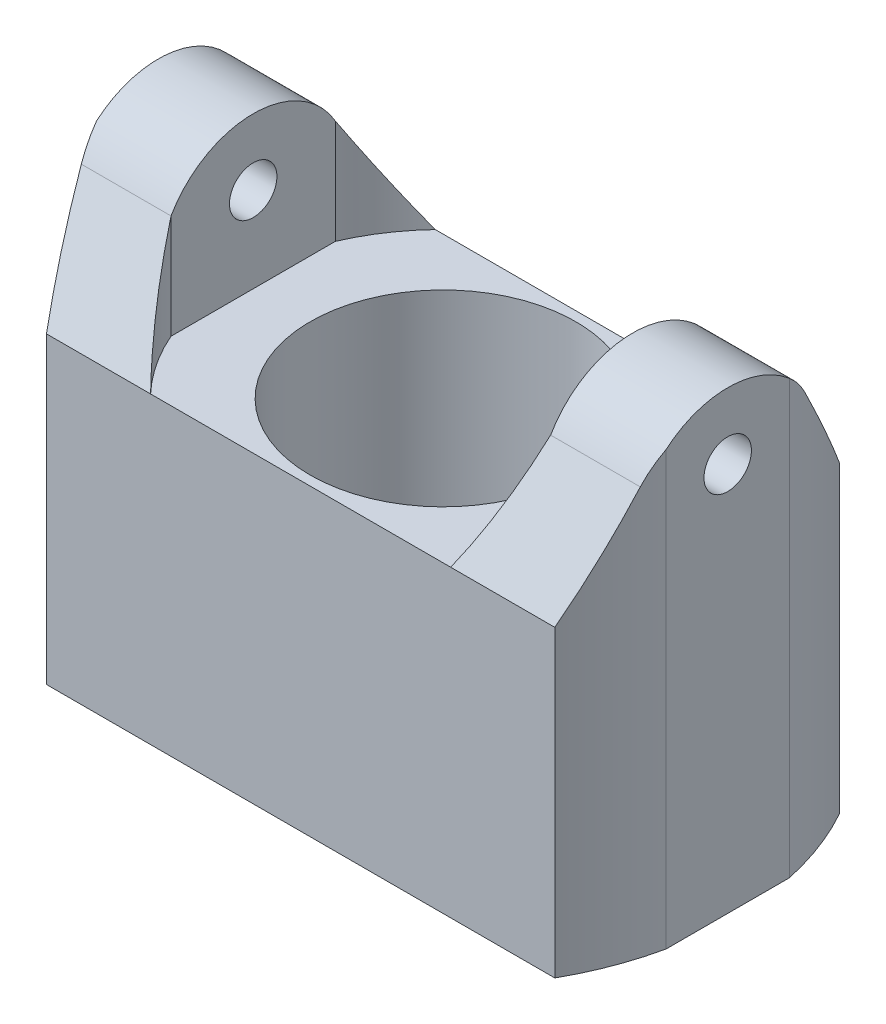
ISO-10303-21;
HEADER;
FILE_DESCRIPTION(('STEP AP214'),'2;1');
FILE_NAME('part.step','',(''),(''),'','','');
FILE_SCHEMA(('AUTOMOTIVE_DESIGN { 1 0 10303 214 1 1 1 1 }'));
ENDSEC;
DATA;
#1=APPLICATION_CONTEXT('core data for automotive mechanical design processes');
#2=APPLICATION_PROTOCOL_DEFINITION('international standard','automotive_design',2000,#1);
#3=PRODUCT_CONTEXT('',#1,'mechanical');
#4=PRODUCT('Part','Part','',(#3));
#5=PRODUCT_RELATED_PRODUCT_CATEGORY('part','',(#4));
#6=PRODUCT_DEFINITION_FORMATION('','',#4);
#7=PRODUCT_DEFINITION_CONTEXT('part definition',#1,'design');
#8=PRODUCT_DEFINITION('design','',#6,#7);
#9=PRODUCT_DEFINITION_SHAPE('','',#8);
#10=(LENGTH_UNIT() NAMED_UNIT(*) SI_UNIT(.MILLI.,.METRE.));
#11=(NAMED_UNIT(*) PLANE_ANGLE_UNIT() SI_UNIT($,.RADIAN.));
#12=(NAMED_UNIT(*) SI_UNIT($,.STERADIAN.) SOLID_ANGLE_UNIT());
#13=UNCERTAINTY_MEASURE_WITH_UNIT(LENGTH_MEASURE(1.E-05),#10,'distance_accuracy_value','');
#14=(GEOMETRIC_REPRESENTATION_CONTEXT(3) GLOBAL_UNCERTAINTY_ASSIGNED_CONTEXT((#13)) GLOBAL_UNIT_ASSIGNED_CONTEXT((#10,
#11,#12)) REPRESENTATION_CONTEXT('',''));
#15=CARTESIAN_POINT('',(0.,0.,0.));
#16=DIRECTION('',(0.,0.,1.));
#17=DIRECTION('',(1.,0.,0.));
#18=AXIS2_PLACEMENT_3D('',#15,#16,#17);
#19=CARTESIAN_POINT('',(0.,32.,0.));
#20=DIRECTION('',(0.,-1.,0.));
#21=DIRECTION('',(0.,0.,-1.));
#22=AXIS2_PLACEMENT_3D('',#19,#20,#21);
#23=CYLINDRICAL_SURFACE('',#22,14.);
#24=CARTESIAN_POINT('',(0.,0.,0.));
#25=DIRECTION('',(0.,1.,0.));
#26=DIRECTION('',(0.,0.,1.));
#27=AXIS2_PLACEMENT_3D('',#24,#25,#26);
#28=CIRCLE('',#27,14.);
#29=CARTESIAN_POINT('',(0.,0.,14.));
#30=VERTEX_POINT('',#29);
#31=EDGE_CURVE('E212',#30,#30,#28,.T.);
#32=ORIENTED_EDGE('',*,*,#31,.F.);
#33=EDGE_LOOP('',(#32));
#34=FACE_BOUND('',#33,.T.);
#35=CARTESIAN_POINT('',(0.,32.,0.));
#36=DIRECTION('',(0.,1.,0.));
#37=DIRECTION('',(0.,0.,1.));
#38=AXIS2_PLACEMENT_3D('',#35,#36,#37);
#39=CIRCLE('',#38,14.);
#40=CARTESIAN_POINT('',(0.,32.,14.));
#41=VERTEX_POINT('',#40);
#42=EDGE_CURVE('E345',#41,#41,#39,.T.);
#43=ORIENTED_EDGE('',*,*,#42,.T.);
#44=EDGE_LOOP('',(#43));
#45=FACE_BOUND('',#44,.T.);
#46=ADVANCED_FACE('F45',(#34,#45),#23,.F.);
#47=CARTESIAN_POINT('',(-30.,32.,-15.));
#48=DIRECTION('',(0.,0.5,-0.866025403784439));
#49=DIRECTION('',(0.,0.866025403784439,0.5));
#50=AXIS2_PLACEMENT_3D('',#47,#48,#49);
#51=PLANE('',#50);
#52=CARTESIAN_POINT('',(0.,57.9807621135332,0.));
#53=DIRECTION('',(0.,0.5,-0.866025403784439));
#54=DIRECTION('',(0.,0.866025403784439,0.5));
#55=AXIS2_PLACEMENT_3D('',#52,#53,#54);
#56=ELLIPSE('',#55,43.5889894354067,21.7944947177034);
#57=CARTESIAN_POINT('',(-15.8113883008419,32.,-15.));
#58=VERTEX_POINT('',#57);
#59=CARTESIAN_POINT('',(-20.,42.9807621135332,-8.66025403784438));
#60=VERTEX_POINT('',#59);
#61=EDGE_CURVE('E12',#58,#60,#56,.T.);
#62=ORIENTED_EDGE('',*,*,#61,.F.);
#63=DIRECTION('',(1.,0.,0.));
#64=VECTOR('',#63,1.);
#65=CARTESIAN_POINT('',(0.,32.,-15.));
#66=LINE('',#65,#64);
#67=CARTESIAN_POINT('',(-26.7815234816842,32.,-15.));
#68=VERTEX_POINT('',#67);
#69=EDGE_CURVE('E208',#68,#58,#66,.T.);
#70=ORIENTED_EDGE('',*,*,#69,.F.);
#71=CARTESIAN_POINT('',(0.,57.9807621135332,0.));
#72=DIRECTION('',(0.,0.5,-0.866025403784439));
#73=DIRECTION('',(0.,-0.866025403784439,-0.5));
#74=AXIS2_PLACEMENT_3D('',#71,#72,#73);
#75=ELLIPSE('',#74,61.3921819126833,30.6960909563417);
#76=CARTESIAN_POINT('',(-29.4491086452544,42.9807621135332,-8.66025403784439));
#77=VERTEX_POINT('',#76);
#78=EDGE_CURVE('E206',#68,#77,#75,.T.);
#79=ORIENTED_EDGE('',*,*,#78,.T.);
#80=DIRECTION('',(1.,0.,0.));
#81=VECTOR('',#80,1.);
#82=CARTESIAN_POINT('',(-30.,42.9807621135332,-8.66025403784439));
#83=LINE('',#82,#81);
#84=EDGE_CURVE('E246',#77,#60,#83,.T.);
#85=ORIENTED_EDGE('',*,*,#84,.T.);
#86=EDGE_LOOP('',(#62,#70,#79,#85));
#87=FACE_BOUND('',#86,.T.);
#88=ADVANCED_FACE('F383',(#87),#51,.T.);
#89=CARTESIAN_POINT('',(-30.,57.9807621135332,0.));
#90=DIRECTION('',(0.,0.5,0.866025403784439));
#91=DIRECTION('',(0.,-0.866025403784439,0.5));
#92=AXIS2_PLACEMENT_3D('',#89,#90,#91);
#93=PLANE('',#92);
#94=CARTESIAN_POINT('',(0.,57.9807621135332,0.));
#95=DIRECTION('',(0.,0.5,0.866025403784439));
#96=DIRECTION('',(0.,0.866025403784439,-0.5));
#97=AXIS2_PLACEMENT_3D('',#94,#95,#96);
#98=ELLIPSE('',#97,43.5889894354067,21.7944947177034);
#99=CARTESIAN_POINT('',(-20.,42.9807621135332,8.66025403784438));
#100=VERTEX_POINT('',#99);
#101=CARTESIAN_POINT('',(-15.8113883008419,32.,15.));
#102=VERTEX_POINT('',#101);
#103=EDGE_CURVE('E189',#100,#102,#98,.T.);
#104=ORIENTED_EDGE('',*,*,#103,.F.);
#105=DIRECTION('',(1.,0.,0.));
#106=VECTOR('',#105,1.);
#107=CARTESIAN_POINT('',(-30.,42.9807621135332,8.66025403784438));
#108=LINE('',#107,#106);
#109=CARTESIAN_POINT('',(-29.4491086452545,42.9807621135332,8.66025403784437));
#110=VERTEX_POINT('',#109);
#111=EDGE_CURVE('E250',#100,#110,#108,.F.);
#112=ORIENTED_EDGE('',*,*,#111,.T.);
#113=CARTESIAN_POINT('',(0.,57.9807621135332,0.));
#114=DIRECTION('',(0.,0.5,0.866025403784439));
#115=DIRECTION('',(0.,-0.866025403784439,0.5));
#116=AXIS2_PLACEMENT_3D('',#113,#114,#115);
#117=ELLIPSE('',#116,61.3921819126833,30.6960909563417);
#118=CARTESIAN_POINT('',(-26.7815234816842,32.,15.));
#119=VERTEX_POINT('',#118);
#120=EDGE_CURVE('E242',#110,#119,#117,.T.);
#121=ORIENTED_EDGE('',*,*,#120,.T.);
#122=DIRECTION('',(1.,0.,0.));
#123=VECTOR('',#122,1.);
#124=CARTESIAN_POINT('',(0.,32.,15.));
#125=LINE('',#124,#123);
#126=EDGE_CURVE('E196',#119,#102,#125,.T.);
#127=ORIENTED_EDGE('',*,*,#126,.T.);
#128=EDGE_LOOP('',(#104,#112,#121,#127));
#129=FACE_BOUND('',#128,.T.);
#130=ADVANCED_FACE('F398',(#129),#93,.T.);
#131=CARTESIAN_POINT('',(-30.,37.9807621135332,0.));
#132=DIRECTION('',(1.,0.,0.));
#133=DIRECTION('',(0.,0.,-1.));
#134=AXIS2_PLACEMENT_3D('',#131,#132,#133);
#135=CYLINDRICAL_SURFACE('',#134,10.);
#136=ORIENTED_EDGE('',*,*,#111,.F.);
#137=CARTESIAN_POINT('',(-20.,37.9807621135332,0.));
#138=DIRECTION('',(1.,0.,0.));
#139=DIRECTION('',(0.,0.,-1.));
#140=AXIS2_PLACEMENT_3D('',#137,#138,#139);
#141=CIRCLE('',#140,10.);
#142=EDGE_CURVE('E304',#100,#60,#141,.F.);
#143=ORIENTED_EDGE('',*,*,#142,.T.);
#144=ORIENTED_EDGE('',*,*,#84,.F.);
#145=CARTESIAN_POINT('',(-30.,45.5801041903184,-6.50000000000006));
#146=CARTESIAN_POINT('',(-29.9532601023231,45.3955812702753,-6.71575552910253));
#147=CARTESIAN_POINT('',(-29.9057968039422,45.2019285615652,-6.92353636684264));
#148=CARTESIAN_POINT('',(-29.811099045601,44.7990989092248,-7.3204923359371));
#149=CARTESIAN_POINT('',(-29.763865305243,44.5900399469733,-7.50978737336666));
#150=CARTESIAN_POINT('',(-29.6706107548025,44.1565124197164,-7.87016891632744));
#151=CARTESIAN_POINT('',(-29.6245899635624,43.9320436155255,-8.04125513912352));
#152=CARTESIAN_POINT('',(-29.5347549452907,43.467491571078,-8.36520427513907));
#153=CARTESIAN_POINT('',(-29.4909585318305,43.2273095367894,-8.51793042782775));
#154=CARTESIAN_POINT('',(-29.4491086452544,42.9807621135332,-8.66025403784439));
#155=B_SPLINE_CURVE_WITH_KNOTS('',3,(#145,#146,#147,#148,#149,#150,#151,#152,#153,#154),
.UNSPECIFIED.,.F.,.F.,(4,2,2,2,4),(0.,0.862900272022733,1.71976863042053,2.57665029179667,
3.4395639483904),.UNSPECIFIED.);
#156=CARTESIAN_POINT('',(-30.,45.5801041903184,-6.50000000000006));
#157=VERTEX_POINT('',#156);
#158=EDGE_CURVE('E280',#157,#77,#155,.T.);
#159=ORIENTED_EDGE('',*,*,#158,.F.);
#160=CARTESIAN_POINT('',(-30.,37.9807621135332,0.));
#161=DIRECTION('',(-1.,0.,0.));
#162=DIRECTION('',(0.,0.,1.));
#163=AXIS2_PLACEMENT_3D('',#160,#161,#162);
#164=CIRCLE('',#163,10.);
#165=CARTESIAN_POINT('',(-30.,45.5801041903184,6.50000000000006));
#166=VERTEX_POINT('',#165);
#167=EDGE_CURVE('E259',#166,#157,#164,.T.);
#168=ORIENTED_EDGE('',*,*,#167,.F.);
#169=CARTESIAN_POINT('',(-29.4491086452544,42.9807621135332,8.66025403784438));
#170=CARTESIAN_POINT('',(-29.4909585318305,43.2273095367894,8.51793042782775));
#171=CARTESIAN_POINT('',(-29.5347549452907,43.467491571078,8.36520427513906));
#172=CARTESIAN_POINT('',(-29.6245899635624,43.9320436155255,8.04125513912351));
#173=CARTESIAN_POINT('',(-29.6706107548025,44.1565124197164,7.87016891632744));
#174=CARTESIAN_POINT('',(-29.763865305243,44.5900399469733,7.50978737336666));
#175=CARTESIAN_POINT('',(-29.811099045601,44.7990989092248,7.3204923359371));
#176=CARTESIAN_POINT('',(-29.9057968039422,45.2019285615652,6.92353636684263));
#177=CARTESIAN_POINT('',(-29.9532601023231,45.3955812702753,6.71575552910253));
#178=CARTESIAN_POINT('',(-30.,45.5801041903184,6.50000000000005));
#179=B_SPLINE_CURVE_WITH_KNOTS('',3,(#169,#170,#171,#172,#173,#174,#175,#176,#177,#178),
.UNSPECIFIED.,.F.,.F.,(4,2,2,2,4),(0.,0.862913656593736,1.71979531796987,2.57666367636766,
3.4395639483904),.UNSPECIFIED.);
#180=EDGE_CURVE('E252',#110,#166,#179,.T.);
#181=ORIENTED_EDGE('',*,*,#180,.F.);
#182=EDGE_LOOP('',(#136,#143,#144,#159,#168,#181));
#183=FACE_BOUND('',#182,.T.);
#184=ADVANCED_FACE('F261',(#183),#135,.T.);
#185=CARTESIAN_POINT('',(60.,41.,0.));
#186=DIRECTION('',(-1.,0.,0.));
#187=DIRECTION('',(0.,0.,1.));
#188=AXIS2_PLACEMENT_3D('',#185,#186,#187);
#189=CYLINDRICAL_SURFACE('',#188,2.5);
#190=CARTESIAN_POINT('',(-30.,41.,0.));
#191=DIRECTION('',(-1.,0.,0.));
#192=DIRECTION('',(0.,0.,1.));
#193=AXIS2_PLACEMENT_3D('',#190,#191,#192);
#194=CIRCLE('',#193,2.5);
#195=CARTESIAN_POINT('',(-30.,41.,2.5));
#196=VERTEX_POINT('',#195);
#197=EDGE_CURVE('E370',#196,#196,#194,.T.);
#198=CARTESIAN_POINT('',(-20.,41.,0.));
#199=DIRECTION('',(1.,0.,0.));
#200=DIRECTION('',(0.,0.,-1.));
#201=AXIS2_PLACEMENT_3D('',#198,#199,#200);
#202=CIRCLE('',#201,2.5);
#203=CARTESIAN_POINT('',(-20.,41.,2.5));
#204=VERTEX_POINT('',#203);
#205=EDGE_CURVE('E302',#204,#204,#202,.F.);
#206=CARTESIAN_POINT('',(-30.,41.,2.5));
#207=CARTESIAN_POINT('',(-29.8958333333333,41.,2.5));
#208=CARTESIAN_POINT('',(-29.7916666666667,41.,2.5));
#209=CARTESIAN_POINT('',(-29.5833333333333,41.,2.5));
#210=CARTESIAN_POINT('',(-29.4791666666666,41.,2.5));
#211=CARTESIAN_POINT('',(-29.2708333333333,41.,2.5));
#212=CARTESIAN_POINT('',(-29.1666666666667,41.,2.5));
#213=CARTESIAN_POINT('',(-28.9583333333333,41.,2.5));
#214=CARTESIAN_POINT('',(-28.8541666666666,41.,2.5));
#215=CARTESIAN_POINT('',(-28.6458333333333,41.,2.5));
#216=CARTESIAN_POINT('',(-28.5416666666667,41.,2.5));
#217=CARTESIAN_POINT('',(-28.3333333333333,41.,2.5));
#218=CARTESIAN_POINT('',(-28.2291666666666,41.,2.5));
#219=CARTESIAN_POINT('',(-28.0208333333333,41.,2.5));
#220=CARTESIAN_POINT('',(-27.9166666666667,41.,2.5));
#221=CARTESIAN_POINT('',(-27.7083333333333,41.,2.5));
#222=CARTESIAN_POINT('',(-27.6041666666666,41.,2.5));
#223=CARTESIAN_POINT('',(-27.3958333333333,41.,2.5));
#224=CARTESIAN_POINT('',(-27.2916666666666,41.,2.5));
#225=CARTESIAN_POINT('',(-27.0833333333333,41.,2.5));
#226=CARTESIAN_POINT('',(-26.9791666666667,41.,2.5));
#227=CARTESIAN_POINT('',(-26.7708333333333,41.,2.5));
#228=CARTESIAN_POINT('',(-26.6666666666667,41.,2.5));
#229=CARTESIAN_POINT('',(-26.4583333333333,41.,2.5));
#230=CARTESIAN_POINT('',(-26.3541666666667,41.,2.5));
#231=CARTESIAN_POINT('',(-26.1458333333333,41.,2.5));
#232=CARTESIAN_POINT('',(-26.0416666666667,41.,2.5));
#233=CARTESIAN_POINT('',(-25.8333333333333,41.,2.5));
#234=CARTESIAN_POINT('',(-25.7291666666667,41.,2.5));
#235=CARTESIAN_POINT('',(-25.5208333333333,41.,2.5));
#236=CARTESIAN_POINT('',(-25.4166666666667,41.,2.5));
#237=CARTESIAN_POINT('',(-25.2083333333333,41.,2.5));
#238=CARTESIAN_POINT('',(-25.1041666666667,41.,2.5));
#239=CARTESIAN_POINT('',(-24.8958333333333,41.,2.5));
#240=CARTESIAN_POINT('',(-24.7916666666667,41.,2.5));
#241=CARTESIAN_POINT('',(-24.5833333333333,41.,2.5));
#242=CARTESIAN_POINT('',(-24.4791666666667,41.,2.5));
#243=CARTESIAN_POINT('',(-24.2708333333333,41.,2.5));
#244=CARTESIAN_POINT('',(-24.1666666666667,41.,2.5));
#245=CARTESIAN_POINT('',(-23.9583333333333,41.,2.5));
#246=CARTESIAN_POINT('',(-23.8541666666667,41.,2.5));
#247=CARTESIAN_POINT('',(-23.6458333333333,41.,2.5));
#248=CARTESIAN_POINT('',(-23.5416666666667,41.,2.5));
#249=CARTESIAN_POINT('',(-23.3333333333333,41.,2.5));
#250=CARTESIAN_POINT('',(-23.2291666666667,41.,2.5));
#251=CARTESIAN_POINT('',(-23.0208333333333,41.,2.5));
#252=CARTESIAN_POINT('',(-22.9166666666667,41.,2.5));
#253=CARTESIAN_POINT('',(-22.7083333333333,41.,2.5));
#254=CARTESIAN_POINT('',(-22.6041666666667,41.,2.5));
#255=CARTESIAN_POINT('',(-22.3958333333333,41.,2.5));
#256=CARTESIAN_POINT('',(-22.2916666666667,41.,2.5));
#257=CARTESIAN_POINT('',(-22.0833333333333,41.,2.5));
#258=CARTESIAN_POINT('',(-21.9791666666667,41.,2.5));
#259=CARTESIAN_POINT('',(-21.7708333333333,41.,2.5));
#260=CARTESIAN_POINT('',(-21.6666666666667,41.,2.5));
#261=CARTESIAN_POINT('',(-21.4583333333333,41.,2.5));
#262=CARTESIAN_POINT('',(-21.3541666666667,41.,2.5));
#263=CARTESIAN_POINT('',(-21.1458333333333,41.,2.5));
#264=CARTESIAN_POINT('',(-21.0416666666667,41.,2.5));
#265=CARTESIAN_POINT('',(-20.8333333333333,41.,2.5));
#266=CARTESIAN_POINT('',(-20.7291666666667,41.,2.5));
#267=CARTESIAN_POINT('',(-20.5208333333333,41.,2.5));
#268=CARTESIAN_POINT('',(-20.4166666666667,41.,2.5));
#269=CARTESIAN_POINT('',(-20.2083333333333,41.,2.5));
#270=CARTESIAN_POINT('',(-20.1041666666667,41.,2.5));
#271=CARTESIAN_POINT('',(-20.,41.,2.5));
#272=B_SPLINE_CURVE_WITH_KNOTS('',3,(#206,#207,#208,#209,#210,#211,#212,#213,#214,#215,#216,
#217,#218,#219,#220,#221,#222,#223,#224,#225,#226,#227,#228,#229,#230,#231,#232,#233,#234,#235,
#236,#237,#238,#239,#240,#241,#242,#243,#244,#245,#246,#247,#248,#249,#250,#251,#252,#253,#254,
#255,#256,#257,#258,#259,#260,#261,#262,#263,#264,#265,#266,#267,#268,#269,#270,#271),
.UNSPECIFIED.,.F.,.F.,(4,2,2,2,2,2,2,2,2,2,2,2,2,2,2,2,2,2,2,2,2,2,2,2,2,2,2,2,2,2,2,2,4),(0.,
0.312499999999993,0.625000000000001,0.937499999999994,1.25,1.56249999999999,1.875,2.1875,2.5,
2.8125,3.12499999999999,3.4375,3.74999999999999,4.0625,4.37499999999999,4.6875,4.99999999999999,
5.31249999999998,5.62499999999999,5.93749999999998,6.24999999999999,6.56249999999998,
6.87499999999999,7.18749999999999,7.49999999999998,7.81249999999999,8.12499999999998,
8.43749999999999,8.74999999999998,9.06249999999999,9.37499999999998,9.68749999999999,
9.99999999999998),.UNSPECIFIED.);
#273=EDGE_CURVE('BSEAM433',#196,#204,#272,.T.);
#274=ORIENTED_EDGE('',*,*,#197,.T.);
#275=ORIENTED_EDGE('',*,*,#205,.F.);
#276=ORIENTED_EDGE('',*,*,#273,.T.);
#277=ORIENTED_EDGE('',*,*,#273,.F.);
#278=EDGE_LOOP('',(#274,#276,#275,#277));
#279=FACE_BOUND('',#278,.T.);
#280=ADVANCED_FACE('F433',(#279),#189,.F.);
#281=CARTESIAN_POINT('',(30.,32.,0.));
#282=DIRECTION('',(-1.,0.,0.));
#283=DIRECTION('',(0.,0.,1.));
#284=AXIS2_PLACEMENT_3D('',#281,#282,#283);
#285=PLANE('',#284);
#286=CARTESIAN_POINT('',(30.,41.,0.));
#287=DIRECTION('',(-1.,0.,0.));
#288=DIRECTION('',(0.,0.,1.));
#289=AXIS2_PLACEMENT_3D('',#286,#287,#288);
#290=CIRCLE('',#289,2.5);
#291=CARTESIAN_POINT('',(30.,41.,2.5));
#292=VERTEX_POINT('',#291);
#293=EDGE_CURVE('E375',#292,#292,#290,.T.);
#294=ORIENTED_EDGE('',*,*,#293,.T.);
#295=EDGE_LOOP('',(#294));
#296=FACE_BOUND('',#295,.T.);
#297=DIRECTION('',(0.,-1.,0.));
#298=VECTOR('',#297,1.);
#299=CARTESIAN_POINT('',(30.,32.,-6.5));
#300=LINE('',#299,#298);
#301=CARTESIAN_POINT('',(30.,45.5801041903185,-6.5));
#302=VERTEX_POINT('',#301);
#303=CARTESIAN_POINT('',(30.,0.,-6.5));
#304=VERTEX_POINT('',#303);
#305=EDGE_CURVE('E237',#302,#304,#300,.T.);
#306=ORIENTED_EDGE('',*,*,#305,.F.);
#307=CARTESIAN_POINT('',(30.,37.9807621135332,0.));
#308=DIRECTION('',(-1.,0.,0.));
#309=DIRECTION('',(0.,0.,1.));
#310=AXIS2_PLACEMENT_3D('',#307,#308,#309);
#311=CIRCLE('',#310,10.);
#312=CARTESIAN_POINT('',(30.,45.5801041903185,6.5));
#313=VERTEX_POINT('',#312);
#314=EDGE_CURVE('E69',#302,#313,#311,.F.);
#315=ORIENTED_EDGE('',*,*,#314,.T.);
#316=DIRECTION('',(0.,-1.,0.));
#317=VECTOR('',#316,1.);
#318=CARTESIAN_POINT('',(30.,32.,6.5));
#319=LINE('',#318,#317);
#320=CARTESIAN_POINT('',(30.,0.,6.5));
#321=VERTEX_POINT('',#320);
#322=EDGE_CURVE('E239',#313,#321,#319,.T.);
#323=ORIENTED_EDGE('',*,*,#322,.T.);
#324=DIRECTION('',(0.,0.,-1.));
#325=VECTOR('',#324,1.);
#326=CARTESIAN_POINT('',(30.,0.,0.));
#327=LINE('',#326,#325);
#328=EDGE_CURVE('E218',#321,#304,#327,.T.);
#329=ORIENTED_EDGE('',*,*,#328,.T.);
#330=EDGE_LOOP('',(#306,#315,#323,#329));
#331=FACE_BOUND('',#330,.T.);
#332=ADVANCED_FACE('F417',(#296,#331),#285,.F.);
#333=CARTESIAN_POINT('',(-30.,32.,0.));
#334=DIRECTION('',(-1.,0.,0.));
#335=DIRECTION('',(0.,0.,1.));
#336=AXIS2_PLACEMENT_3D('',#333,#334,#335);
#337=PLANE('',#336);
#338=ORIENTED_EDGE('',*,*,#197,.F.);
#339=EDGE_LOOP('',(#338));
#340=FACE_BOUND('',#339,.T.);
#341=DIRECTION('',(0.,-1.,0.));
#342=VECTOR('',#341,1.);
#343=CARTESIAN_POINT('',(-30.,32.,6.50000000000006));
#344=LINE('',#343,#342);
#345=CARTESIAN_POINT('',(-30.,0.,6.50000000000006));
#346=VERTEX_POINT('',#345);
#347=EDGE_CURVE('E228',#166,#346,#344,.T.);
#348=ORIENTED_EDGE('',*,*,#347,.F.);
#349=ORIENTED_EDGE('',*,*,#167,.T.);
#350=DIRECTION('',(0.,-1.,0.));
#351=VECTOR('',#350,1.);
#352=CARTESIAN_POINT('',(-30.,32.,-6.50000000000006));
#353=LINE('',#352,#351);
#354=CARTESIAN_POINT('',(-30.,0.,-6.50000000000006));
#355=VERTEX_POINT('',#354);
#356=EDGE_CURVE('E230',#157,#355,#353,.T.);
#357=ORIENTED_EDGE('',*,*,#356,.T.);
#358=DIRECTION('',(0.,0.,-1.));
#359=VECTOR('',#358,1.);
#360=CARTESIAN_POINT('',(-30.,0.,0.));
#361=LINE('',#360,#359);
#362=EDGE_CURVE('E200',#346,#355,#361,.T.);
#363=ORIENTED_EDGE('',*,*,#362,.F.);
#364=EDGE_LOOP('',(#348,#349,#357,#363));
#365=FACE_BOUND('',#364,.T.);
#366=ADVANCED_FACE('F274',(#340,#365),#337,.T.);
#367=CARTESIAN_POINT('',(0.,32.,15.));
#368=DIRECTION('',(0.,0.,-1.));
#369=DIRECTION('',(-1.,0.,0.));
#370=AXIS2_PLACEMENT_3D('',#367,#368,#369);
#371=PLANE('',#370);
#372=DIRECTION('',(1.,0.,0.));
#373=VECTOR('',#372,1.);
#374=CARTESIAN_POINT('',(0.,0.,15.));
#375=LINE('',#374,#373);
#376=CARTESIAN_POINT('',(-26.7815234816842,0.,15.));
#377=VERTEX_POINT('',#376);
#378=CARTESIAN_POINT('',(26.7815234816842,0.,15.));
#379=VERTEX_POINT('',#378);
#380=EDGE_CURVE('E215',#377,#379,#375,.T.);
#381=ORIENTED_EDGE('',*,*,#380,.T.);
#382=DIRECTION('',(0.,-1.,0.));
#383=VECTOR('',#382,1.);
#384=CARTESIAN_POINT('',(26.7815234816842,32.,15.));
#385=LINE('',#384,#383);
#386=CARTESIAN_POINT('',(26.7815234816842,32.,15.));
#387=VERTEX_POINT('',#386);
#388=EDGE_CURVE('E195',#387,#379,#385,.T.);
#389=ORIENTED_EDGE('',*,*,#388,.F.);
#390=CARTESIAN_POINT('',(15.8113883008419,32.,15.));
#391=VERTEX_POINT('',#390);
#392=EDGE_CURVE('E185',#391,#387,#125,.T.);
#393=ORIENTED_EDGE('',*,*,#392,.F.);
#394=DIRECTION('',(1.,0.,0.));
#395=VECTOR('',#394,1.);
#396=CARTESIAN_POINT('',(0.,32.,15.));
#397=LINE('',#396,#395);
#398=EDGE_CURVE('E167',#102,#391,#397,.T.);
#399=ORIENTED_EDGE('',*,*,#398,.F.);
#400=ORIENTED_EDGE('',*,*,#126,.F.);
#401=DIRECTION('',(0.,-1.,0.));
#402=VECTOR('',#401,1.);
#403=CARTESIAN_POINT('',(-26.7815234816842,32.,15.));
#404=LINE('',#403,#402);
#405=EDGE_CURVE('E211',#119,#377,#404,.T.);
#406=ORIENTED_EDGE('',*,*,#405,.T.);
#407=EDGE_LOOP('',(#381,#389,#393,#399,#400,#406));
#408=FACE_BOUND('',#407,.T.);
#409=ADVANCED_FACE('F193',(#408),#371,.F.);
#410=CARTESIAN_POINT('',(0.,32.,0.));
#411=DIRECTION('',(0.,-1.,0.));
#412=DIRECTION('',(0.,0.,-1.));
#413=AXIS2_PLACEMENT_3D('',#410,#411,#412);
#414=CYLINDRICAL_SURFACE('',#413,30.6960909563417);
#415=ORIENTED_EDGE('',*,*,#322,.F.);
#416=CARTESIAN_POINT('',(30.,45.5801041903185,6.5));
#417=CARTESIAN_POINT('',(29.9532601023231,45.3955812702754,6.71575552910248));
#418=CARTESIAN_POINT('',(29.9057968039422,45.2019285615652,6.92353636684259));
#419=CARTESIAN_POINT('',(29.811099045601,44.7990989092248,7.32049233593706));
#420=CARTESIAN_POINT('',(29.763865305243,44.5900399469734,7.50978737336663));
#421=CARTESIAN_POINT('',(29.6706107548026,44.1565124197164,7.87016891632742));
#422=CARTESIAN_POINT('',(29.6245899635624,43.9320436155255,8.0412551391235));
#423=CARTESIAN_POINT('',(29.5347549452907,43.467491571078,8.36520427513905));
#424=CARTESIAN_POINT('',(29.4909585318305,43.2273095367894,8.51793042782775));
#425=CARTESIAN_POINT('',(29.4491086452544,42.9807621135332,8.66025403784439));
#426=B_SPLINE_CURVE_WITH_KNOTS('',3,(#416,#417,#418,#419,#420,#421,#422,#423,#424,#425),
.UNSPECIFIED.,.F.,.F.,(4,2,2,2,4),(0.,0.86290027202275,1.71976863042056,2.57665029179672,
3.43956394839047),.UNSPECIFIED.);
#427=CARTESIAN_POINT('',(29.4491086452544,42.9807621135332,8.66025403784438));
#428=VERTEX_POINT('',#427);
#429=EDGE_CURVE('E190',#313,#428,#426,.T.);
#430=ORIENTED_EDGE('',*,*,#429,.T.);
#431=CARTESIAN_POINT('',(0.,57.9807621135332,0.));
#432=DIRECTION('',(0.,0.5,0.866025403784439));
#433=DIRECTION('',(0.,-0.866025403784439,0.5));
#434=AXIS2_PLACEMENT_3D('',#431,#432,#433);
#435=ELLIPSE('',#434,61.3921819126833,30.6960909563417);
#436=EDGE_CURVE('E378',#387,#428,#435,.T.);
#437=ORIENTED_EDGE('',*,*,#436,.F.);
#438=ORIENTED_EDGE('',*,*,#388,.T.);
#439=CARTESIAN_POINT('',(0.,0.,0.));
#440=DIRECTION('',(0.,1.,0.));
#441=DIRECTION('',(0.,0.,1.));
#442=AXIS2_PLACEMENT_3D('',#439,#440,#441);
#443=CIRCLE('',#442,30.6960909563417);
#444=EDGE_CURVE('E203',#379,#321,#443,.T.);
#445=ORIENTED_EDGE('',*,*,#444,.T.);
#446=EDGE_LOOP('',(#415,#430,#437,#438,#445));
#447=FACE_BOUND('',#446,.T.);
#448=ADVANCED_FACE('F272',(#447),#414,.T.);
#449=CARTESIAN_POINT('',(0.,57.9807621135332,0.));
#450=DIRECTION('',(0.,0.5,-0.866025403784439));
#451=DIRECTION('',(0.,-0.866025403784439,-0.5));
#452=AXIS2_PLACEMENT_3D('',#449,#450,#451);
#453=ELLIPSE('',#452,61.3921819126833,30.6960909563417);
#454=CARTESIAN_POINT('',(29.4491086452545,42.9807621135332,-8.66025403784437));
#455=VERTEX_POINT('',#454);
#456=CARTESIAN_POINT('',(26.7815234816842,32.,-15.));
#457=VERTEX_POINT('',#456);
#458=EDGE_CURVE('E324',#455,#457,#453,.T.);
#459=ORIENTED_EDGE('',*,*,#458,.F.);
#460=CARTESIAN_POINT('',(29.4491086452544,42.9807621135332,-8.66025403784439));
#461=CARTESIAN_POINT('',(29.4909585318305,43.2273095367894,-8.51793042782775));
#462=CARTESIAN_POINT('',(29.5347549452907,43.467491571078,-8.36520427513906));
#463=CARTESIAN_POINT('',(29.6245899635624,43.9320436155255,-8.0412551391235));
#464=CARTESIAN_POINT('',(29.6706107548026,44.1565124197164,-7.87016891632742));
#465=CARTESIAN_POINT('',(29.763865305243,44.5900399469734,-7.50978737336663));
#466=CARTESIAN_POINT('',(29.811099045601,44.7990989092248,-7.32049233593706));
#467=CARTESIAN_POINT('',(29.9057968039422,45.2019285615653,-6.92353636684258));
#468=CARTESIAN_POINT('',(29.9532601023231,45.3955812702754,-6.71575552910247));
#469=CARTESIAN_POINT('',(30.,45.5801041903185,-6.49999999999999));
#470=B_SPLINE_CURVE_WITH_KNOTS('',3,(#460,#461,#462,#463,#464,#465,#466,#467,#468,#469),
.UNSPECIFIED.,.F.,.F.,(4,2,2,2,4),(0.,0.862913656593762,1.71979531796992,2.57666367636773,
3.43956394839048),.UNSPECIFIED.);
#471=EDGE_CURVE('E286',#455,#302,#470,.T.);
#472=ORIENTED_EDGE('',*,*,#471,.T.);
#473=ORIENTED_EDGE('',*,*,#305,.T.);
#474=CARTESIAN_POINT('',(26.7815234816842,0.,-15.));
#475=VERTEX_POINT('',#474);
#476=EDGE_CURVE('E219',#304,#475,#443,.T.);
#477=ORIENTED_EDGE('',*,*,#476,.T.);
#478=DIRECTION('',(0.,-1.,0.));
#479=VECTOR('',#478,1.);
#480=CARTESIAN_POINT('',(26.7815234816842,32.,-15.));
#481=LINE('',#480,#479);
#482=EDGE_CURVE('E234',#457,#475,#481,.T.);
#483=ORIENTED_EDGE('',*,*,#482,.F.);
#484=EDGE_LOOP('',(#459,#472,#473,#477,#483));
#485=FACE_BOUND('',#484,.T.);
#486=ADVANCED_FACE('F415',(#485),#414,.T.);
#487=CARTESIAN_POINT('',(0.,32.,-15.));
#488=DIRECTION('',(0.,0.,-1.));
#489=DIRECTION('',(-1.,0.,0.));
#490=AXIS2_PLACEMENT_3D('',#487,#488,#489);
#491=PLANE('',#490);
#492=ORIENTED_EDGE('',*,*,#69,.T.);
#493=DIRECTION('',(1.,0.,0.));
#494=VECTOR('',#493,1.);
#495=CARTESIAN_POINT('',(0.,32.,-15.));
#496=LINE('',#495,#494);
#497=CARTESIAN_POINT('',(15.8113883008419,32.,-15.));
#498=VERTEX_POINT('',#497);
#499=EDGE_CURVE('E318',#58,#498,#496,.T.);
#500=ORIENTED_EDGE('',*,*,#499,.T.);
#501=EDGE_CURVE('E199',#498,#457,#66,.T.);
#502=ORIENTED_EDGE('',*,*,#501,.T.);
#503=ORIENTED_EDGE('',*,*,#482,.T.);
#504=DIRECTION('',(1.,0.,0.));
#505=VECTOR('',#504,1.);
#506=CARTESIAN_POINT('',(0.,0.,-15.));
#507=LINE('',#506,#505);
#508=CARTESIAN_POINT('',(-26.7815234816842,0.,-15.));
#509=VERTEX_POINT('',#508);
#510=EDGE_CURVE('E222',#509,#475,#507,.T.);
#511=ORIENTED_EDGE('',*,*,#510,.F.);
#512=DIRECTION('',(0.,-1.,0.));
#513=VECTOR('',#512,1.);
#514=CARTESIAN_POINT('',(-26.7815234816842,32.,-15.));
#515=LINE('',#514,#513);
#516=EDGE_CURVE('E232',#68,#509,#515,.T.);
#517=ORIENTED_EDGE('',*,*,#516,.F.);
#518=EDGE_LOOP('',(#492,#500,#502,#503,#511,#517));
#519=FACE_BOUND('',#518,.T.);
#520=ADVANCED_FACE('F327',(#519),#491,.T.);
#521=ORIENTED_EDGE('',*,*,#356,.F.);
#522=ORIENTED_EDGE('',*,*,#158,.T.);
#523=ORIENTED_EDGE('',*,*,#78,.F.);
#524=ORIENTED_EDGE('',*,*,#516,.T.);
#525=EDGE_CURVE('E202',#509,#355,#443,.T.);
#526=ORIENTED_EDGE('',*,*,#525,.T.);
#527=EDGE_LOOP('',(#521,#522,#523,#524,#526));
#528=FACE_BOUND('',#527,.T.);
#529=ADVANCED_FACE('F270',(#528),#414,.T.);
#530=ORIENTED_EDGE('',*,*,#120,.F.);
#531=ORIENTED_EDGE('',*,*,#180,.T.);
#532=ORIENTED_EDGE('',*,*,#347,.T.);
#533=EDGE_CURVE('E197',#346,#377,#443,.T.);
#534=ORIENTED_EDGE('',*,*,#533,.T.);
#535=ORIENTED_EDGE('',*,*,#405,.F.);
#536=EDGE_LOOP('',(#530,#531,#532,#534,#535));
#537=FACE_BOUND('',#536,.T.);
#538=ADVANCED_FACE('F264',(#537),#414,.T.);
#539=CARTESIAN_POINT('',(0.,0.,0.));
#540=DIRECTION('',(0.,1.,0.));
#541=DIRECTION('',(0.,0.,1.));
#542=AXIS2_PLACEMENT_3D('',#539,#540,#541);
#543=PLANE('',#542);
#544=CARTESIAN_POINT('',(-15.5,0.,-9.));
#545=DIRECTION('',(0.,-1.,0.));
#546=DIRECTION('',(0.,0.,-1.));
#547=AXIS2_PLACEMENT_3D('',#544,#545,#546);
#548=CIRCLE('',#547,2.5);
#549=CARTESIAN_POINT('',(-15.5,0.,-11.5));
#550=VERTEX_POINT('',#549);
#551=EDGE_CURVE('E348',#550,#550,#548,.T.);
#552=ORIENTED_EDGE('',*,*,#551,.F.);
#553=EDGE_LOOP('',(#552));
#554=FACE_BOUND('',#553,.T.);
#555=CARTESIAN_POINT('',(15.5,0.,-9.));
#556=DIRECTION('',(0.,-1.,0.));
#557=DIRECTION('',(0.,0.,-1.));
#558=AXIS2_PLACEMENT_3D('',#555,#556,#557);
#559=CIRCLE('',#558,2.49999999999999);
#560=CARTESIAN_POINT('',(15.5,0.,-11.5));
#561=VERTEX_POINT('',#560);
#562=EDGE_CURVE('E359',#561,#561,#559,.T.);
#563=ORIENTED_EDGE('',*,*,#562,.F.);
#564=EDGE_LOOP('',(#563));
#565=FACE_BOUND('',#564,.T.);
#566=CARTESIAN_POINT('',(15.5,0.,9.00000000000001));
#567=DIRECTION('',(0.,-1.,0.));
#568=DIRECTION('',(0.,0.,-1.));
#569=AXIS2_PLACEMENT_3D('',#566,#567,#568);
#570=CIRCLE('',#569,2.49999999999999);
#571=CARTESIAN_POINT('',(15.5,0.,6.50000000000001));
#572=VERTEX_POINT('',#571);
#573=EDGE_CURVE('E353',#572,#572,#570,.T.);
#574=ORIENTED_EDGE('',*,*,#573,.F.);
#575=EDGE_LOOP('',(#574));
#576=FACE_BOUND('',#575,.T.);
#577=CARTESIAN_POINT('',(-15.5,0.,9.00000000000001));
#578=DIRECTION('',(0.,-1.,0.));
#579=DIRECTION('',(0.,0.,-1.));
#580=AXIS2_PLACEMENT_3D('',#577,#578,#579);
#581=CIRCLE('',#580,2.5);
#582=CARTESIAN_POINT('',(-15.5,0.,6.50000000000001));
#583=VERTEX_POINT('',#582);
#584=EDGE_CURVE('E352',#583,#583,#581,.T.);
#585=ORIENTED_EDGE('',*,*,#584,.F.);
#586=EDGE_LOOP('',(#585));
#587=FACE_BOUND('',#586,.T.);
#588=ORIENTED_EDGE('',*,*,#31,.T.);
#589=EDGE_LOOP('',(#588));
#590=FACE_BOUND('',#589,.T.);
#591=ORIENTED_EDGE('',*,*,#380,.F.);
#592=ORIENTED_EDGE('',*,*,#533,.F.);
#593=ORIENTED_EDGE('',*,*,#362,.T.);
#594=ORIENTED_EDGE('',*,*,#525,.F.);
#595=ORIENTED_EDGE('',*,*,#510,.T.);
#596=ORIENTED_EDGE('',*,*,#476,.F.);
#597=ORIENTED_EDGE('',*,*,#328,.F.);
#598=ORIENTED_EDGE('',*,*,#444,.F.);
#599=EDGE_LOOP('',(#591,#592,#593,#594,#595,#596,#597,#598));
#600=FACE_BOUND('',#599,.T.);
#601=ADVANCED_FACE('F269',(#554,#565,#576,#587,#590,#600),#543,.F.);
#602=CARTESIAN_POINT('',(0.,57.9807621135332,0.));
#603=DIRECTION('',(0.,0.5,-0.866025403784439));
#604=DIRECTION('',(0.,0.866025403784439,0.5));
#605=AXIS2_PLACEMENT_3D('',#602,#603,#604);
#606=ELLIPSE('',#605,43.5889894354067,21.7944947177034);
#607=CARTESIAN_POINT('',(20.,42.9807621135332,-8.66025403784438));
#608=VERTEX_POINT('',#607);
#609=EDGE_CURVE('E54',#608,#498,#606,.T.);
#610=ORIENTED_EDGE('',*,*,#609,.F.);
#611=DIRECTION('',(1.,0.,0.));
#612=VECTOR('',#611,1.);
#613=CARTESIAN_POINT('',(-30.,42.9807621135332,-8.66025403784439));
#614=LINE('',#613,#612);
#615=EDGE_CURVE('E244',#608,#455,#614,.T.);
#616=ORIENTED_EDGE('',*,*,#615,.T.);
#617=ORIENTED_EDGE('',*,*,#458,.T.);
#618=ORIENTED_EDGE('',*,*,#501,.F.);
#619=EDGE_LOOP('',(#610,#616,#617,#618));
#620=FACE_BOUND('',#619,.T.);
#621=ADVANCED_FACE('F322',(#620),#51,.T.);
#622=CARTESIAN_POINT('',(0.,57.9807621135332,0.));
#623=DIRECTION('',(0.,0.5,0.866025403784439));
#624=DIRECTION('',(0.,0.866025403784439,-0.5));
#625=AXIS2_PLACEMENT_3D('',#622,#623,#624);
#626=ELLIPSE('',#625,43.5889894354067,21.7944947177034);
#627=CARTESIAN_POINT('',(20.,42.9807621135332,8.66025403784438));
#628=VERTEX_POINT('',#627);
#629=EDGE_CURVE('E162',#391,#628,#626,.T.);
#630=ORIENTED_EDGE('',*,*,#629,.F.);
#631=ORIENTED_EDGE('',*,*,#392,.T.);
#632=ORIENTED_EDGE('',*,*,#436,.T.);
#633=DIRECTION('',(1.,0.,0.));
#634=VECTOR('',#633,1.);
#635=CARTESIAN_POINT('',(-30.,42.9807621135332,8.66025403784438));
#636=LINE('',#635,#634);
#637=EDGE_CURVE('E188',#428,#628,#636,.F.);
#638=ORIENTED_EDGE('',*,*,#637,.T.);
#639=EDGE_LOOP('',(#630,#631,#632,#638));
#640=FACE_BOUND('',#639,.T.);
#641=ADVANCED_FACE('F183',(#640),#93,.T.);
#642=CARTESIAN_POINT('',(-30.,37.9807621135332,0.));
#643=DIRECTION('',(1.,0.,0.));
#644=DIRECTION('',(0.,0.,-1.));
#645=AXIS2_PLACEMENT_3D('',#642,#643,#644);
#646=CYLINDRICAL_SURFACE('',#645,10.);
#647=CARTESIAN_POINT('',(20.,37.9807621135332,0.));
#648=DIRECTION('',(1.,0.,0.));
#649=DIRECTION('',(0.,0.,-1.));
#650=AXIS2_PLACEMENT_3D('',#647,#648,#649);
#651=CIRCLE('',#650,10.);
#652=EDGE_CURVE('E300',#628,#608,#651,.F.);
#653=ORIENTED_EDGE('',*,*,#652,.F.);
#654=ORIENTED_EDGE('',*,*,#637,.F.);
#655=ORIENTED_EDGE('',*,*,#429,.F.);
#656=ORIENTED_EDGE('',*,*,#314,.F.);
#657=ORIENTED_EDGE('',*,*,#471,.F.);
#658=ORIENTED_EDGE('',*,*,#615,.F.);
#659=EDGE_LOOP('',(#653,#654,#655,#656,#657,#658));
#660=FACE_BOUND('',#659,.T.);
#661=ADVANCED_FACE('F47',(#660),#646,.T.);
#662=CARTESIAN_POINT('',(20.,41.,0.));
#663=DIRECTION('',(1.,0.,0.));
#664=DIRECTION('',(0.,0.,-1.));
#665=AXIS2_PLACEMENT_3D('',#662,#663,#664);
#666=CIRCLE('',#665,2.5);
#667=CARTESIAN_POINT('',(20.,41.,2.5));
#668=VERTEX_POINT('',#667);
#669=EDGE_CURVE('E297',#668,#668,#666,.F.);
#670=CARTESIAN_POINT('',(20.,41.,2.5));
#671=CARTESIAN_POINT('',(20.1041666666667,41.,2.5));
#672=CARTESIAN_POINT('',(20.2083333333333,41.,2.5));
#673=CARTESIAN_POINT('',(20.4166666666667,41.,2.5));
#674=CARTESIAN_POINT('',(20.5208333333333,41.,2.5));
#675=CARTESIAN_POINT('',(20.7291666666667,41.,2.5));
#676=CARTESIAN_POINT('',(20.8333333333333,41.,2.5));
#677=CARTESIAN_POINT('',(21.0416666666667,41.,2.5));
#678=CARTESIAN_POINT('',(21.1458333333333,41.,2.5));
#679=CARTESIAN_POINT('',(21.3541666666667,41.,2.5));
#680=CARTESIAN_POINT('',(21.4583333333333,41.,2.5));
#681=CARTESIAN_POINT('',(21.6666666666667,41.,2.5));
#682=CARTESIAN_POINT('',(21.7708333333333,41.,2.5));
#683=CARTESIAN_POINT('',(21.9791666666667,41.,2.5));
#684=CARTESIAN_POINT('',(22.0833333333333,41.,2.5));
#685=CARTESIAN_POINT('',(22.2916666666667,41.,2.5));
#686=CARTESIAN_POINT('',(22.3958333333333,41.,2.5));
#687=CARTESIAN_POINT('',(22.6041666666667,41.,2.5));
#688=CARTESIAN_POINT('',(22.7083333333333,41.,2.5));
#689=CARTESIAN_POINT('',(22.9166666666667,41.,2.5));
#690=CARTESIAN_POINT('',(23.0208333333333,41.,2.5));
#691=CARTESIAN_POINT('',(23.2291666666667,41.,2.5));
#692=CARTESIAN_POINT('',(23.3333333333333,41.,2.5));
#693=CARTESIAN_POINT('',(23.5416666666667,41.,2.5));
#694=CARTESIAN_POINT('',(23.6458333333333,41.,2.5));
#695=CARTESIAN_POINT('',(23.8541666666667,41.,2.5));
#696=CARTESIAN_POINT('',(23.9583333333333,41.,2.5));
#697=CARTESIAN_POINT('',(24.1666666666667,41.,2.5));
#698=CARTESIAN_POINT('',(24.2708333333333,41.,2.5));
#699=CARTESIAN_POINT('',(24.4791666666667,41.,2.5));
#700=CARTESIAN_POINT('',(24.5833333333333,41.,2.5));
#701=CARTESIAN_POINT('',(24.7916666666667,41.,2.5));
#702=CARTESIAN_POINT('',(24.8958333333333,41.,2.5));
#703=CARTESIAN_POINT('',(25.1041666666667,41.,2.5));
#704=CARTESIAN_POINT('',(25.2083333333333,41.,2.5));
#705=CARTESIAN_POINT('',(25.4166666666667,41.,2.5));
#706=CARTESIAN_POINT('',(25.5208333333333,41.,2.5));
#707=CARTESIAN_POINT('',(25.7291666666667,41.,2.5));
#708=CARTESIAN_POINT('',(25.8333333333333,41.,2.5));
#709=CARTESIAN_POINT('',(26.0416666666667,41.,2.5));
#710=CARTESIAN_POINT('',(26.1458333333333,41.,2.5));
#711=CARTESIAN_POINT('',(26.3541666666667,41.,2.5));
#712=CARTESIAN_POINT('',(26.4583333333333,41.,2.5));
#713=CARTESIAN_POINT('',(26.6666666666667,41.,2.5));
#714=CARTESIAN_POINT('',(26.7708333333333,41.,2.5));
#715=CARTESIAN_POINT('',(26.9791666666667,41.,2.5));
#716=CARTESIAN_POINT('',(27.0833333333333,41.,2.5));
#717=CARTESIAN_POINT('',(27.2916666666667,41.,2.5));
#718=CARTESIAN_POINT('',(27.3958333333333,41.,2.5));
#719=CARTESIAN_POINT('',(27.6041666666667,41.,2.5));
#720=CARTESIAN_POINT('',(27.7083333333333,41.,2.5));
#721=CARTESIAN_POINT('',(27.9166666666667,41.,2.5));
#722=CARTESIAN_POINT('',(28.0208333333333,41.,2.5));
#723=CARTESIAN_POINT('',(28.2291666666667,41.,2.5));
#724=CARTESIAN_POINT('',(28.3333333333333,41.,2.5));
#725=CARTESIAN_POINT('',(28.5416666666667,41.,2.5));
#726=CARTESIAN_POINT('',(28.6458333333333,41.,2.5));
#727=CARTESIAN_POINT('',(28.8541666666667,41.,2.5));
#728=CARTESIAN_POINT('',(28.9583333333333,41.,2.5));
#729=CARTESIAN_POINT('',(29.1666666666667,41.,2.5));
#730=CARTESIAN_POINT('',(29.2708333333333,41.,2.5));
#731=CARTESIAN_POINT('',(29.4791666666667,41.,2.5));
#732=CARTESIAN_POINT('',(29.5833333333333,41.,2.5));
#733=CARTESIAN_POINT('',(29.7916666666667,41.,2.5));
#734=CARTESIAN_POINT('',(29.8958333333333,41.,2.5));
#735=CARTESIAN_POINT('',(30.,41.,2.5));
#736=B_SPLINE_CURVE_WITH_KNOTS('',3,(#670,#671,#672,#673,#674,#675,#676,#677,#678,#679,#680,
#681,#682,#683,#684,#685,#686,#687,#688,#689,#690,#691,#692,#693,#694,#695,#696,#697,#698,#699,
#700,#701,#702,#703,#704,#705,#706,#707,#708,#709,#710,#711,#712,#713,#714,#715,#716,#717,#718,
#719,#720,#721,#722,#723,#724,#725,#726,#727,#728,#729,#730,#731,#732,#733,#734,#735),
.UNSPECIFIED.,.F.,.F.,(4,2,2,2,2,2,2,2,2,2,2,2,2,2,2,2,2,2,2,2,2,2,2,2,2,2,2,2,2,2,2,2,4),(0.,
0.3125,0.625000000000001,0.937500000000001,1.25,1.5625,1.875,2.1875,2.5,2.81250000000001,
3.12500000000001,3.43750000000001,3.75000000000001,4.06250000000001,4.37500000000001,
4.68750000000001,5.00000000000001,5.31250000000001,5.62500000000001,5.93750000000001,
6.25000000000001,6.56250000000001,6.87500000000001,7.18750000000001,7.50000000000002,
7.81250000000001,8.12500000000002,8.43750000000002,8.75000000000002,9.06250000000002,
9.37500000000002,9.68750000000002,10.),.UNSPECIFIED.);
#737=EDGE_CURVE('BSEAM428',#668,#292,#736,.T.);
#738=ORIENTED_EDGE('',*,*,#669,.T.);
#739=ORIENTED_EDGE('',*,*,#293,.F.);
#740=ORIENTED_EDGE('',*,*,#737,.T.);
#741=ORIENTED_EDGE('',*,*,#737,.F.);
#742=EDGE_LOOP('',(#738,#740,#739,#741));
#743=FACE_BOUND('',#742,.T.);
#744=ADVANCED_FACE('F428',(#743),#189,.F.);
#745=CARTESIAN_POINT('',(-15.5,6.,9.00000000000001));
#746=DIRECTION('',(0.,-1.,0.));
#747=DIRECTION('',(0.,0.,-1.));
#748=AXIS2_PLACEMENT_3D('',#745,#746,#747);
#749=CYLINDRICAL_SURFACE('',#748,2.5);
#750=CARTESIAN_POINT('',(-15.5,6.,9.00000000000001));
#751=DIRECTION('',(0.,-1.,0.));
#752=DIRECTION('',(0.,0.,-1.));
#753=AXIS2_PLACEMENT_3D('',#750,#751,#752);
#754=CIRCLE('',#753,2.5);
#755=CARTESIAN_POINT('',(-15.5,6.,6.50000000000001));
#756=VERTEX_POINT('',#755);
#757=EDGE_CURVE('E367',#756,#756,#754,.T.);
#758=ORIENTED_EDGE('',*,*,#757,.F.);
#759=EDGE_LOOP('',(#758));
#760=FACE_BOUND('',#759,.T.);
#761=ORIENTED_EDGE('',*,*,#584,.T.);
#762=EDGE_LOOP('',(#761));
#763=FACE_BOUND('',#762,.T.);
#764=ADVANCED_FACE('F431',(#760,#763),#749,.F.);
#765=CARTESIAN_POINT('',(-15.5,6.,9.00000000000001));
#766=DIRECTION('',(0.,-1.,0.));
#767=DIRECTION('',(0.,0.,-1.));
#768=AXIS2_PLACEMENT_3D('',#765,#766,#767);
#769=PLANE('',#768);
#770=ORIENTED_EDGE('',*,*,#757,.T.);
#771=EDGE_LOOP('',(#770));
#772=FACE_BOUND('',#771,.T.);
#773=ADVANCED_FACE('F505',(#772),#769,.T.);
#774=CARTESIAN_POINT('',(15.5,6.,9.00000000000001));
#775=DIRECTION('',(0.,-1.,0.));
#776=DIRECTION('',(0.,0.,-1.));
#777=AXIS2_PLACEMENT_3D('',#774,#775,#776);
#778=CYLINDRICAL_SURFACE('',#777,2.49999999999999);
#779=CARTESIAN_POINT('',(15.5,6.,9.00000000000001));
#780=DIRECTION('',(0.,-1.,0.));
#781=DIRECTION('',(0.,0.,-1.));
#782=AXIS2_PLACEMENT_3D('',#779,#780,#781);
#783=CIRCLE('',#782,2.49999999999999);
#784=CARTESIAN_POINT('',(15.5,6.,6.50000000000001));
#785=VERTEX_POINT('',#784);
#786=EDGE_CURVE('E349',#785,#785,#783,.T.);
#787=ORIENTED_EDGE('',*,*,#786,.F.);
#788=EDGE_LOOP('',(#787));
#789=FACE_BOUND('',#788,.T.);
#790=ORIENTED_EDGE('',*,*,#573,.T.);
#791=EDGE_LOOP('',(#790));
#792=FACE_BOUND('',#791,.T.);
#793=ADVANCED_FACE('F513',(#789,#792),#778,.F.);
#794=CARTESIAN_POINT('',(15.5,6.,9.00000000000001));
#795=DIRECTION('',(0.,-1.,0.));
#796=DIRECTION('',(0.,0.,-1.));
#797=AXIS2_PLACEMENT_3D('',#794,#795,#796);
#798=PLANE('',#797);
#799=ORIENTED_EDGE('',*,*,#786,.T.);
#800=EDGE_LOOP('',(#799));
#801=FACE_BOUND('',#800,.T.);
#802=ADVANCED_FACE('F521',(#801),#798,.T.);
#803=CARTESIAN_POINT('',(15.5,6.,-9.));
#804=DIRECTION('',(0.,-1.,0.));
#805=DIRECTION('',(0.,0.,-1.));
#806=AXIS2_PLACEMENT_3D('',#803,#804,#805);
#807=CYLINDRICAL_SURFACE('',#806,2.49999999999999);
#808=CARTESIAN_POINT('',(15.5,6.,-9.));
#809=DIRECTION('',(0.,-1.,0.));
#810=DIRECTION('',(0.,0.,-1.));
#811=AXIS2_PLACEMENT_3D('',#808,#809,#810);
#812=CIRCLE('',#811,2.49999999999999);
#813=CARTESIAN_POINT('',(15.5,6.,-11.5));
#814=VERTEX_POINT('',#813);
#815=EDGE_CURVE('E356',#814,#814,#812,.T.);
#816=ORIENTED_EDGE('',*,*,#815,.F.);
#817=EDGE_LOOP('',(#816));
#818=FACE_BOUND('',#817,.T.);
#819=ORIENTED_EDGE('',*,*,#562,.T.);
#820=EDGE_LOOP('',(#819));
#821=FACE_BOUND('',#820,.T.);
#822=ADVANCED_FACE('F529',(#818,#821),#807,.F.);
#823=CARTESIAN_POINT('',(15.5,6.,-9.));
#824=DIRECTION('',(0.,-1.,0.));
#825=DIRECTION('',(0.,0.,-1.));
#826=AXIS2_PLACEMENT_3D('',#823,#824,#825);
#827=PLANE('',#826);
#828=ORIENTED_EDGE('',*,*,#815,.T.);
#829=EDGE_LOOP('',(#828));
#830=FACE_BOUND('',#829,.T.);
#831=ADVANCED_FACE('F537',(#830),#827,.T.);
#832=CARTESIAN_POINT('',(-15.5,6.,-9.));
#833=DIRECTION('',(0.,-1.,0.));
#834=DIRECTION('',(0.,0.,-1.));
#835=AXIS2_PLACEMENT_3D('',#832,#833,#834);
#836=CYLINDRICAL_SURFACE('',#835,2.5);
#837=CARTESIAN_POINT('',(-15.5,6.,-9.));
#838=DIRECTION('',(0.,-1.,0.));
#839=DIRECTION('',(0.,0.,-1.));
#840=AXIS2_PLACEMENT_3D('',#837,#838,#839);
#841=CIRCLE('',#840,2.5);
#842=CARTESIAN_POINT('',(-15.5,6.,-11.5));
#843=VERTEX_POINT('',#842);
#844=EDGE_CURVE('E362',#843,#843,#841,.T.);
#845=ORIENTED_EDGE('',*,*,#844,.F.);
#846=EDGE_LOOP('',(#845));
#847=FACE_BOUND('',#846,.T.);
#848=ORIENTED_EDGE('',*,*,#551,.T.);
#849=EDGE_LOOP('',(#848));
#850=FACE_BOUND('',#849,.T.);
#851=ADVANCED_FACE('F545',(#847,#850),#836,.F.);
#852=CARTESIAN_POINT('',(-15.5,6.,-9.));
#853=DIRECTION('',(0.,-1.,0.));
#854=DIRECTION('',(0.,0.,-1.));
#855=AXIS2_PLACEMENT_3D('',#852,#853,#854);
#856=PLANE('',#855);
#857=ORIENTED_EDGE('',*,*,#844,.T.);
#858=EDGE_LOOP('',(#857));
#859=FACE_BOUND('',#858,.T.);
#860=ADVANCED_FACE('F553',(#859),#856,.T.);
#861=CARTESIAN_POINT('',(-20.,32.,0.));
#862=DIRECTION('',(1.,0.,0.));
#863=DIRECTION('',(0.,0.,-1.));
#864=AXIS2_PLACEMENT_3D('',#861,#862,#863);
#865=PLANE('',#864);
#866=DIRECTION('',(0.,1.,0.));
#867=VECTOR('',#866,1.);
#868=CARTESIAN_POINT('',(-20.,32.,8.66025403784438));
#869=LINE('',#868,#867);
#870=CARTESIAN_POINT('',(-20.,32.,8.66025403784438));
#871=VERTEX_POINT('',#870);
#872=EDGE_CURVE('E301',#871,#100,#869,.T.);
#873=ORIENTED_EDGE('',*,*,#872,.F.);
#874=DIRECTION('',(0.,0.,-1.));
#875=VECTOR('',#874,1.);
#876=CARTESIAN_POINT('',(-20.,32.,0.));
#877=LINE('',#876,#875);
#878=CARTESIAN_POINT('',(-20.,32.,-8.66025403784438));
#879=VERTEX_POINT('',#878);
#880=EDGE_CURVE('E331',#871,#879,#877,.T.);
#881=ORIENTED_EDGE('',*,*,#880,.T.);
#882=DIRECTION('',(0.,1.,0.));
#883=VECTOR('',#882,1.);
#884=CARTESIAN_POINT('',(-20.,32.,-8.66025403784438));
#885=LINE('',#884,#883);
#886=EDGE_CURVE('E337',#879,#60,#885,.T.);
#887=ORIENTED_EDGE('',*,*,#886,.T.);
#888=ORIENTED_EDGE('',*,*,#142,.F.);
#889=EDGE_LOOP('',(#873,#881,#887,#888));
#890=FACE_BOUND('',#889,.T.);
#891=ORIENTED_EDGE('',*,*,#205,.T.);
#892=EDGE_LOOP('',(#891));
#893=FACE_BOUND('',#892,.T.);
#894=ADVANCED_FACE('F391',(#890,#893),#865,.T.);
#895=CARTESIAN_POINT('',(20.,32.,0.));
#896=DIRECTION('',(1.,0.,0.));
#897=DIRECTION('',(0.,0.,-1.));
#898=AXIS2_PLACEMENT_3D('',#895,#896,#897);
#899=PLANE('',#898);
#900=ORIENTED_EDGE('',*,*,#652,.T.);
#901=DIRECTION('',(0.,1.,0.));
#902=VECTOR('',#901,1.);
#903=CARTESIAN_POINT('',(20.,32.,-8.66025403784438));
#904=LINE('',#903,#902);
#905=CARTESIAN_POINT('',(20.,32.,-8.66025403784438));
#906=VERTEX_POINT('',#905);
#907=EDGE_CURVE('E312',#906,#608,#904,.T.);
#908=ORIENTED_EDGE('',*,*,#907,.F.);
#909=DIRECTION('',(0.,0.,-1.));
#910=VECTOR('',#909,1.);
#911=CARTESIAN_POINT('',(20.,32.,0.));
#912=LINE('',#911,#910);
#913=CARTESIAN_POINT('',(20.,32.,8.66025403784438));
#914=VERTEX_POINT('',#913);
#915=EDGE_CURVE('E166',#914,#906,#912,.T.);
#916=ORIENTED_EDGE('',*,*,#915,.F.);
#917=DIRECTION('',(0.,1.,0.));
#918=VECTOR('',#917,1.);
#919=CARTESIAN_POINT('',(20.,32.,8.66025403784438));
#920=LINE('',#919,#918);
#921=EDGE_CURVE('E61',#914,#628,#920,.T.);
#922=ORIENTED_EDGE('',*,*,#921,.T.);
#923=EDGE_LOOP('',(#900,#908,#916,#922));
#924=FACE_BOUND('',#923,.T.);
#925=ORIENTED_EDGE('',*,*,#669,.F.);
#926=EDGE_LOOP('',(#925));
#927=FACE_BOUND('',#926,.T.);
#928=ADVANCED_FACE('F422',(#924,#927),#899,.F.);
#929=CARTESIAN_POINT('',(0.,32.,0.));
#930=DIRECTION('',(0.,1.,0.));
#931=DIRECTION('',(0.,0.,1.));
#932=AXIS2_PLACEMENT_3D('',#929,#930,#931);
#933=CYLINDRICAL_SURFACE('',#932,21.7944947177034);
#934=ORIENTED_EDGE('',*,*,#103,.T.);
#935=CARTESIAN_POINT('',(0.,32.,0.));
#936=DIRECTION('',(0.,1.,0.));
#937=DIRECTION('',(0.,0.,1.));
#938=AXIS2_PLACEMENT_3D('',#935,#936,#937);
#939=CIRCLE('',#938,21.7944947177034);
#940=EDGE_CURVE('E169',#871,#102,#939,.T.);
#941=ORIENTED_EDGE('',*,*,#940,.F.);
#942=ORIENTED_EDGE('',*,*,#872,.T.);
#943=EDGE_LOOP('',(#934,#941,#942));
#944=FACE_BOUND('',#943,.T.);
#945=ADVANCED_FACE('F396',(#944),#933,.F.);
#946=ORIENTED_EDGE('',*,*,#61,.T.);
#947=ORIENTED_EDGE('',*,*,#886,.F.);
#948=EDGE_CURVE('E320',#58,#879,#939,.T.);
#949=ORIENTED_EDGE('',*,*,#948,.F.);
#950=EDGE_LOOP('',(#946,#947,#949));
#951=FACE_BOUND('',#950,.T.);
#952=ADVANCED_FACE('F577',(#951),#933,.F.);
#953=ORIENTED_EDGE('',*,*,#609,.T.);
#954=EDGE_CURVE('E170',#906,#498,#939,.T.);
#955=ORIENTED_EDGE('',*,*,#954,.F.);
#956=ORIENTED_EDGE('',*,*,#907,.T.);
#957=EDGE_LOOP('',(#953,#955,#956));
#958=FACE_BOUND('',#957,.T.);
#959=ADVANCED_FACE('F311',(#958),#933,.F.);
#960=ORIENTED_EDGE('',*,*,#629,.T.);
#961=ORIENTED_EDGE('',*,*,#921,.F.);
#962=EDGE_CURVE('E158',#391,#914,#939,.T.);
#963=ORIENTED_EDGE('',*,*,#962,.F.);
#964=EDGE_LOOP('',(#960,#961,#963));
#965=FACE_BOUND('',#964,.T.);
#966=ADVANCED_FACE('F160',(#965),#933,.F.);
#967=CARTESIAN_POINT('',(0.,32.,0.));
#968=DIRECTION('',(0.,1.,0.));
#969=DIRECTION('',(0.,0.,1.));
#970=AXIS2_PLACEMENT_3D('',#967,#968,#969);
#971=PLANE('',#970);
#972=ORIENTED_EDGE('',*,*,#42,.F.);
#973=EDGE_LOOP('',(#972));
#974=FACE_BOUND('',#973,.T.);
#975=ORIENTED_EDGE('',*,*,#398,.T.);
#976=ORIENTED_EDGE('',*,*,#962,.T.);
#977=ORIENTED_EDGE('',*,*,#915,.T.);
#978=ORIENTED_EDGE('',*,*,#954,.T.);
#979=ORIENTED_EDGE('',*,*,#499,.F.);
#980=ORIENTED_EDGE('',*,*,#948,.T.);
#981=ORIENTED_EDGE('',*,*,#880,.F.);
#982=ORIENTED_EDGE('',*,*,#940,.T.);
#983=EDGE_LOOP('',(#975,#976,#977,#978,#979,#980,#981,#982));
#984=FACE_BOUND('',#983,.T.);
#985=ADVANCED_FACE('F173',(#974,#984),#971,.T.);
#986=CLOSED_SHELL('',(#46,#88,#130,#184,#280,#332,#366,#409,#448,#486,#520,#529,#538,#601,#621,
#641,#661,#744,#764,#773,#793,#802,#822,#831,#851,#860,#894,#928,#945,#952,#959,#966,#985));
#987=MANIFOLD_SOLID_BREP('B2',#986);
#988=ADVANCED_BREP_SHAPE_REPRESENTATION('',(#18,#987),#14);
#989=SHAPE_DEFINITION_REPRESENTATION(#9,#988);
ENDSEC;
END-ISO-10303-21;
